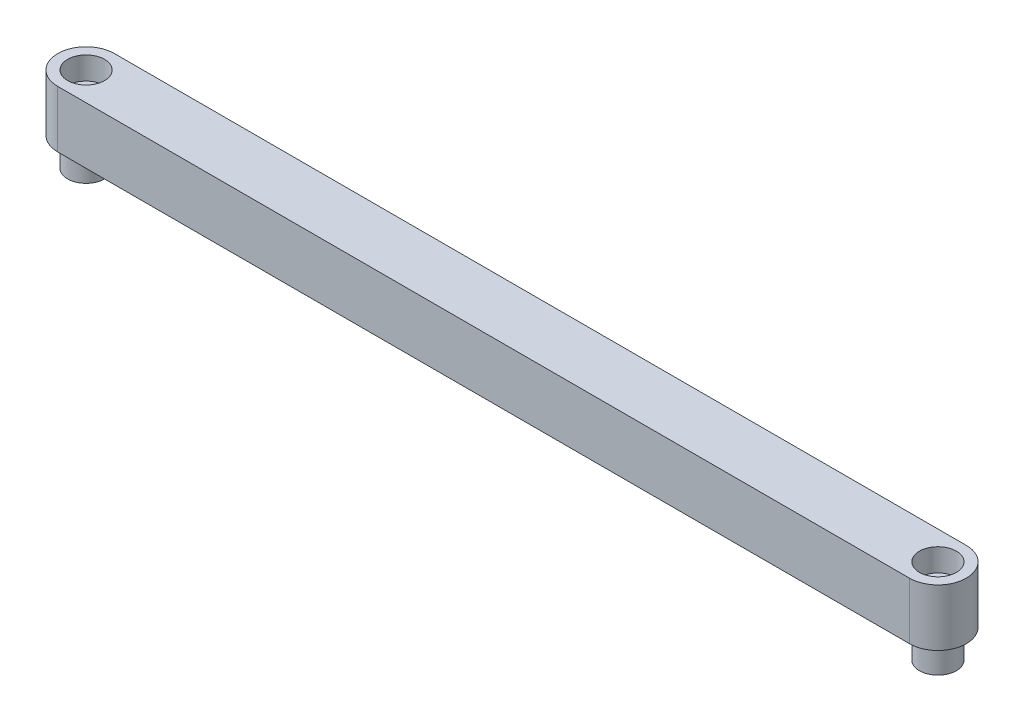
ISO-10303-21;
HEADER;
FILE_DESCRIPTION(('STEP AP214'),'2;1');
FILE_NAME('part.step','',(''),(''),'','','');
FILE_SCHEMA(('AUTOMOTIVE_DESIGN { 1 0 10303 214 1 1 1 1 }'));
ENDSEC;
DATA;
#1=APPLICATION_CONTEXT('core data for automotive mechanical design processes');
#2=APPLICATION_PROTOCOL_DEFINITION('international standard','automotive_design',2000,#1);
#3=PRODUCT_CONTEXT('',#1,'mechanical');
#4=PRODUCT('Part','Part','',(#3));
#5=PRODUCT_RELATED_PRODUCT_CATEGORY('part','',(#4));
#6=PRODUCT_DEFINITION_FORMATION('','',#4);
#7=PRODUCT_DEFINITION_CONTEXT('part definition',#1,'design');
#8=PRODUCT_DEFINITION('design','',#6,#7);
#9=PRODUCT_DEFINITION_SHAPE('','',#8);
#10=(LENGTH_UNIT() NAMED_UNIT(*) SI_UNIT(.MILLI.,.METRE.));
#11=(NAMED_UNIT(*) PLANE_ANGLE_UNIT() SI_UNIT($,.RADIAN.));
#12=(NAMED_UNIT(*) SI_UNIT($,.STERADIAN.) SOLID_ANGLE_UNIT());
#13=UNCERTAINTY_MEASURE_WITH_UNIT(LENGTH_MEASURE(1.E-05),#10,'distance_accuracy_value','');
#14=(GEOMETRIC_REPRESENTATION_CONTEXT(3) GLOBAL_UNCERTAINTY_ASSIGNED_CONTEXT((#13)) GLOBAL_UNIT_ASSIGNED_CONTEXT((#10,
#11,#12)) REPRESENTATION_CONTEXT('',''));
#15=CARTESIAN_POINT('',(0.,0.,0.));
#16=DIRECTION('',(0.,0.,1.));
#17=DIRECTION('',(1.,0.,0.));
#18=AXIS2_PLACEMENT_3D('',#15,#16,#17);
#19=CARTESIAN_POINT('',(-225.,15.,0.));
#20=DIRECTION('',(0.,-1.,0.));
#21=DIRECTION('',(0.,0.,-1.));
#22=AXIS2_PLACEMENT_3D('',#19,#20,#21);
#23=CYLINDRICAL_SURFACE('',#22,15.);
#24=CARTESIAN_POINT('',(-225.,-15.,0.));
#25=DIRECTION('',(0.,1.,0.));
#26=DIRECTION('',(0.,0.,1.));
#27=AXIS2_PLACEMENT_3D('',#24,#25,#26);
#28=CIRCLE('',#27,15.);
#29=CARTESIAN_POINT('',(-225.,-15.,-15.));
#30=VERTEX_POINT('',#29);
#31=CARTESIAN_POINT('',(-225.,-15.,15.));
#32=VERTEX_POINT('',#31);
#33=EDGE_CURVE('E104',#30,#32,#28,.T.);
#34=ORIENTED_EDGE('',*,*,#33,.T.);
#35=DIRECTION('',(0.,-1.,0.));
#36=VECTOR('',#35,1.);
#37=CARTESIAN_POINT('',(-225.,15.,15.));
#38=LINE('',#37,#36);
#39=CARTESIAN_POINT('',(-225.,15.,15.));
#40=VERTEX_POINT('',#39);
#41=EDGE_CURVE('E95',#40,#32,#38,.T.);
#42=ORIENTED_EDGE('',*,*,#41,.F.);
#43=CARTESIAN_POINT('',(-225.,15.,0.));
#44=DIRECTION('',(0.,1.,0.));
#45=DIRECTION('',(0.,0.,1.));
#46=AXIS2_PLACEMENT_3D('',#43,#44,#45);
#47=CIRCLE('',#46,15.);
#48=CARTESIAN_POINT('',(-225.,15.,-15.));
#49=VERTEX_POINT('',#48);
#50=EDGE_CURVE('E89',#49,#40,#47,.T.);
#51=ORIENTED_EDGE('',*,*,#50,.F.);
#52=DIRECTION('',(0.,-1.,0.));
#53=VECTOR('',#52,1.);
#54=CARTESIAN_POINT('',(-225.,15.,-15.));
#55=LINE('',#54,#53);
#56=EDGE_CURVE('E100',#49,#30,#55,.T.);
#57=ORIENTED_EDGE('',*,*,#56,.T.);
#58=EDGE_LOOP('',(#34,#42,#51,#57));
#59=FACE_BOUND('',#58,.T.);
#60=ADVANCED_FACE('F37',(#59),#23,.T.);
#61=CARTESIAN_POINT('',(-225.,15.,15.));
#62=DIRECTION('',(0.,0.,-1.));
#63=DIRECTION('',(-1.,0.,0.));
#64=AXIS2_PLACEMENT_3D('',#61,#62,#63);
#65=PLANE('',#64);
#66=DIRECTION('',(1.,0.,0.));
#67=VECTOR('',#66,1.);
#68=CARTESIAN_POINT('',(-225.,-15.,15.));
#69=LINE('',#68,#67);
#70=CARTESIAN_POINT('',(225.,-15.,15.));
#71=VERTEX_POINT('',#70);
#72=EDGE_CURVE('E94',#32,#71,#69,.T.);
#73=ORIENTED_EDGE('',*,*,#72,.T.);
#74=DIRECTION('',(0.,-1.,0.));
#75=VECTOR('',#74,1.);
#76=CARTESIAN_POINT('',(225.,15.,15.));
#77=LINE('',#76,#75);
#78=CARTESIAN_POINT('',(225.,15.,15.));
#79=VERTEX_POINT('',#78);
#80=EDGE_CURVE('E92',#79,#71,#77,.T.);
#81=ORIENTED_EDGE('',*,*,#80,.F.);
#82=DIRECTION('',(1.,0.,0.));
#83=VECTOR('',#82,1.);
#84=CARTESIAN_POINT('',(-225.,15.,15.));
#85=LINE('',#84,#83);
#86=EDGE_CURVE('E84',#40,#79,#85,.T.);
#87=ORIENTED_EDGE('',*,*,#86,.F.);
#88=ORIENTED_EDGE('',*,*,#41,.T.);
#89=EDGE_LOOP('',(#73,#81,#87,#88));
#90=FACE_BOUND('',#89,.T.);
#91=ADVANCED_FACE('F93',(#90),#65,.F.);
#92=CARTESIAN_POINT('',(225.,15.,0.));
#93=DIRECTION('',(0.,-1.,0.));
#94=DIRECTION('',(0.,0.,-1.));
#95=AXIS2_PLACEMENT_3D('',#92,#93,#94);
#96=CYLINDRICAL_SURFACE('',#95,15.);
#97=CARTESIAN_POINT('',(225.,-15.,0.));
#98=DIRECTION('',(0.,1.,0.));
#99=DIRECTION('',(0.,0.,1.));
#100=AXIS2_PLACEMENT_3D('',#97,#98,#99);
#101=CIRCLE('',#100,15.);
#102=CARTESIAN_POINT('',(225.,-15.,-15.));
#103=VERTEX_POINT('',#102);
#104=EDGE_CURVE('E70',#71,#103,#101,.T.);
#105=ORIENTED_EDGE('',*,*,#104,.T.);
#106=DIRECTION('',(0.,-1.,0.));
#107=VECTOR('',#106,1.);
#108=CARTESIAN_POINT('',(225.,15.,-15.));
#109=LINE('',#108,#107);
#110=CARTESIAN_POINT('',(225.,15.,-15.));
#111=VERTEX_POINT('',#110);
#112=EDGE_CURVE('E96',#111,#103,#109,.T.);
#113=ORIENTED_EDGE('',*,*,#112,.F.);
#114=CARTESIAN_POINT('',(225.,15.,0.));
#115=DIRECTION('',(0.,1.,0.));
#116=DIRECTION('',(0.,0.,1.));
#117=AXIS2_PLACEMENT_3D('',#114,#115,#116);
#118=CIRCLE('',#117,15.);
#119=EDGE_CURVE('E87',#79,#111,#118,.T.);
#120=ORIENTED_EDGE('',*,*,#119,.F.);
#121=ORIENTED_EDGE('',*,*,#80,.T.);
#122=EDGE_LOOP('',(#105,#113,#120,#121));
#123=FACE_BOUND('',#122,.T.);
#124=ADVANCED_FACE('F98',(#123),#96,.T.);
#125=CARTESIAN_POINT('',(-225.,15.,-15.));
#126=DIRECTION('',(0.,0.,1.));
#127=DIRECTION('',(1.,0.,0.));
#128=AXIS2_PLACEMENT_3D('',#125,#126,#127);
#129=PLANE('',#128);
#130=DIRECTION('',(-1.,0.,0.));
#131=VECTOR('',#130,1.);
#132=CARTESIAN_POINT('',(-225.,-15.,-15.));
#133=LINE('',#132,#131);
#134=EDGE_CURVE('E76',#103,#30,#133,.T.);
#135=ORIENTED_EDGE('',*,*,#134,.T.);
#136=ORIENTED_EDGE('',*,*,#56,.F.);
#137=DIRECTION('',(-1.,0.,0.));
#138=VECTOR('',#137,1.);
#139=CARTESIAN_POINT('',(-225.,15.,-15.));
#140=LINE('',#139,#138);
#141=EDGE_CURVE('E53',#111,#49,#140,.T.);
#142=ORIENTED_EDGE('',*,*,#141,.F.);
#143=ORIENTED_EDGE('',*,*,#112,.T.);
#144=EDGE_LOOP('',(#135,#136,#142,#143));
#145=FACE_BOUND('',#144,.T.);
#146=ADVANCED_FACE('F176',(#145),#129,.F.);
#147=CARTESIAN_POINT('',(-225.,15.,0.));
#148=DIRECTION('',(0.,1.,0.));
#149=DIRECTION('',(0.,0.,1.));
#150=AXIS2_PLACEMENT_3D('',#147,#148,#149);
#151=PLANE('',#150);
#152=CARTESIAN_POINT('',(-225.,15.,0.));
#153=DIRECTION('',(0.,1.,0.));
#154=DIRECTION('',(0.,0.,1.));
#155=AXIS2_PLACEMENT_3D('',#152,#153,#154);
#156=CIRCLE('',#155,9.75000000000002);
#157=CARTESIAN_POINT('',(-225.,15.,9.75000000000001));
#158=VERTEX_POINT('',#157);
#159=EDGE_CURVE('E107',#158,#158,#156,.T.);
#160=ORIENTED_EDGE('',*,*,#159,.F.);
#161=EDGE_LOOP('',(#160));
#162=FACE_BOUND('',#161,.T.);
#163=CARTESIAN_POINT('',(225.,15.,0.));
#164=DIRECTION('',(0.,1.,0.));
#165=DIRECTION('',(0.,0.,1.));
#166=AXIS2_PLACEMENT_3D('',#163,#164,#165);
#167=CIRCLE('',#166,9.75000000000002);
#168=CARTESIAN_POINT('',(225.,15.,9.75000000000001));
#169=VERTEX_POINT('',#168);
#170=EDGE_CURVE('E117',#169,#169,#167,.T.);
#171=ORIENTED_EDGE('',*,*,#170,.F.);
#172=EDGE_LOOP('',(#171));
#173=FACE_BOUND('',#172,.T.);
#174=ORIENTED_EDGE('',*,*,#50,.T.);
#175=ORIENTED_EDGE('',*,*,#86,.T.);
#176=ORIENTED_EDGE('',*,*,#119,.T.);
#177=ORIENTED_EDGE('',*,*,#141,.T.);
#178=EDGE_LOOP('',(#174,#175,#176,#177));
#179=FACE_BOUND('',#178,.T.);
#180=ADVANCED_FACE('F85',(#162,#173,#179),#151,.T.);
#181=CARTESIAN_POINT('',(-225.,-15.,0.));
#182=DIRECTION('',(0.,1.,0.));
#183=DIRECTION('',(0.,0.,1.));
#184=AXIS2_PLACEMENT_3D('',#181,#182,#183);
#185=PLANE('',#184);
#186=CARTESIAN_POINT('',(225.,-15.,0.));
#187=DIRECTION('',(0.,1.,0.));
#188=DIRECTION('',(0.,0.,1.));
#189=AXIS2_PLACEMENT_3D('',#186,#187,#188);
#190=CIRCLE('',#189,9.75000000000002);
#191=CARTESIAN_POINT('',(225.,-15.,9.75000000000001));
#192=VERTEX_POINT('',#191);
#193=EDGE_CURVE('E119',#192,#192,#190,.T.);
#194=ORIENTED_EDGE('',*,*,#193,.T.);
#195=EDGE_LOOP('',(#194));
#196=FACE_BOUND('',#195,.T.);
#197=CARTESIAN_POINT('',(-225.,-15.,0.));
#198=DIRECTION('',(0.,1.,0.));
#199=DIRECTION('',(0.,0.,1.));
#200=AXIS2_PLACEMENT_3D('',#197,#198,#199);
#201=CIRCLE('',#200,9.75000000000002);
#202=CARTESIAN_POINT('',(-225.,-15.,9.75000000000001));
#203=VERTEX_POINT('',#202);
#204=EDGE_CURVE('E114',#203,#203,#201,.T.);
#205=ORIENTED_EDGE('',*,*,#204,.T.);
#206=EDGE_LOOP('',(#205));
#207=FACE_BOUND('',#206,.T.);
#208=ORIENTED_EDGE('',*,*,#33,.F.);
#209=ORIENTED_EDGE('',*,*,#134,.F.);
#210=ORIENTED_EDGE('',*,*,#104,.F.);
#211=ORIENTED_EDGE('',*,*,#72,.F.);
#212=EDGE_LOOP('',(#208,#209,#210,#211));
#213=FACE_BOUND('',#212,.T.);
#214=ADVANCED_FACE('F166',(#196,#207,#213),#185,.F.);
#215=CARTESIAN_POINT('',(225.,15.,0.));
#216=DIRECTION('',(0.,-1.,0.));
#217=DIRECTION('',(0.,0.,-1.));
#218=AXIS2_PLACEMENT_3D('',#215,#216,#217);
#219=CYLINDRICAL_SURFACE('',#218,9.75000000000002);
#220=CARTESIAN_POINT('',(225.,3.,0.));
#221=DIRECTION('',(0.,1.,0.));
#222=DIRECTION('',(0.,0.,1.));
#223=AXIS2_PLACEMENT_3D('',#220,#221,#222);
#224=CIRCLE('',#223,9.75000000000002);
#225=CARTESIAN_POINT('',(225.,3.,9.75000000000001));
#226=VERTEX_POINT('',#225);
#227=EDGE_CURVE('E11',#226,#226,#224,.T.);
#228=ORIENTED_EDGE('',*,*,#227,.F.);
#229=EDGE_LOOP('',(#228));
#230=FACE_BOUND('',#229,.T.);
#231=ORIENTED_EDGE('',*,*,#170,.T.);
#232=EDGE_LOOP('',(#231));
#233=FACE_BOUND('',#232,.T.);
#234=ADVANCED_FACE('F131',(#230,#233),#219,.F.);
#235=CARTESIAN_POINT('',(-225.,15.,0.));
#236=DIRECTION('',(0.,-1.,0.));
#237=DIRECTION('',(0.,0.,-1.));
#238=AXIS2_PLACEMENT_3D('',#235,#236,#237);
#239=CYLINDRICAL_SURFACE('',#238,9.75000000000002);
#240=CARTESIAN_POINT('',(-225.,3.,0.));
#241=DIRECTION('',(0.,1.,0.));
#242=DIRECTION('',(0.,0.,1.));
#243=AXIS2_PLACEMENT_3D('',#240,#241,#242);
#244=CIRCLE('',#243,9.75000000000002);
#245=CARTESIAN_POINT('',(-225.,3.,9.75000000000001));
#246=VERTEX_POINT('',#245);
#247=EDGE_CURVE('E45',#246,#246,#244,.T.);
#248=ORIENTED_EDGE('',*,*,#247,.F.);
#249=EDGE_LOOP('',(#248));
#250=FACE_BOUND('',#249,.T.);
#251=ORIENTED_EDGE('',*,*,#159,.T.);
#252=EDGE_LOOP('',(#251));
#253=FACE_BOUND('',#252,.T.);
#254=ADVANCED_FACE('F127',(#250,#253),#239,.F.);
#255=CARTESIAN_POINT('',(-225.,-30.,0.));
#256=DIRECTION('',(0.,1.,0.));
#257=DIRECTION('',(0.,0.,1.));
#258=AXIS2_PLACEMENT_3D('',#255,#256,#257);
#259=CYLINDRICAL_SURFACE('',#258,9.75000000000002);
#260=CARTESIAN_POINT('',(-225.,-30.,0.));
#261=DIRECTION('',(0.,1.,0.));
#262=DIRECTION('',(0.,0.,1.));
#263=AXIS2_PLACEMENT_3D('',#260,#261,#262);
#264=CIRCLE('',#263,9.75000000000002);
#265=CARTESIAN_POINT('',(-225.,-30.,9.75000000000001));
#266=VERTEX_POINT('',#265);
#267=EDGE_CURVE('E118',#266,#266,#264,.T.);
#268=ORIENTED_EDGE('',*,*,#267,.T.);
#269=EDGE_LOOP('',(#268));
#270=FACE_BOUND('',#269,.T.);
#271=ORIENTED_EDGE('',*,*,#204,.F.);
#272=EDGE_LOOP('',(#271));
#273=FACE_BOUND('',#272,.T.);
#274=ADVANCED_FACE('F130',(#270,#273),#259,.T.);
#275=CARTESIAN_POINT('',(-225.,-30.,0.));
#276=DIRECTION('',(0.,1.,0.));
#277=DIRECTION('',(0.,0.,1.));
#278=AXIS2_PLACEMENT_3D('',#275,#276,#277);
#279=PLANE('',#278);
#280=ORIENTED_EDGE('',*,*,#267,.F.);
#281=EDGE_LOOP('',(#280));
#282=FACE_BOUND('',#281,.T.);
#283=ADVANCED_FACE('F157',(#282),#279,.F.);
#284=CARTESIAN_POINT('',(225.,-30.,0.));
#285=DIRECTION('',(0.,1.,0.));
#286=DIRECTION('',(0.,0.,1.));
#287=AXIS2_PLACEMENT_3D('',#284,#285,#286);
#288=CYLINDRICAL_SURFACE('',#287,9.75000000000002);
#289=CARTESIAN_POINT('',(225.,-30.,0.));
#290=DIRECTION('',(0.,1.,0.));
#291=DIRECTION('',(0.,0.,1.));
#292=AXIS2_PLACEMENT_3D('',#289,#290,#291);
#293=CIRCLE('',#292,9.75000000000002);
#294=CARTESIAN_POINT('',(225.,-30.,9.75000000000001));
#295=VERTEX_POINT('',#294);
#296=EDGE_CURVE('E121',#295,#295,#293,.T.);
#297=ORIENTED_EDGE('',*,*,#296,.T.);
#298=EDGE_LOOP('',(#297));
#299=FACE_BOUND('',#298,.T.);
#300=ORIENTED_EDGE('',*,*,#193,.F.);
#301=EDGE_LOOP('',(#300));
#302=FACE_BOUND('',#301,.T.);
#303=ADVANCED_FACE('F145',(#299,#302),#288,.T.);
#304=CARTESIAN_POINT('',(225.,-30.,0.));
#305=DIRECTION('',(0.,1.,0.));
#306=DIRECTION('',(0.,0.,1.));
#307=AXIS2_PLACEMENT_3D('',#304,#305,#306);
#308=PLANE('',#307);
#309=ORIENTED_EDGE('',*,*,#296,.F.);
#310=EDGE_LOOP('',(#309));
#311=FACE_BOUND('',#310,.T.);
#312=ADVANCED_FACE('F148',(#311),#308,.F.);
#313=CARTESIAN_POINT('',(-225.,3.,0.));
#314=DIRECTION('',(0.,1.,0.));
#315=DIRECTION('',(0.,0.,1.));
#316=AXIS2_PLACEMENT_3D('',#313,#314,#315);
#317=PLANE('',#316);
#318=ORIENTED_EDGE('',*,*,#247,.T.);
#319=EDGE_LOOP('',(#318));
#320=FACE_BOUND('',#319,.T.);
#321=ADVANCED_FACE('F125',(#320),#317,.T.);
#322=CARTESIAN_POINT('',(225.,3.,0.));
#323=DIRECTION('',(0.,1.,0.));
#324=DIRECTION('',(0.,0.,1.));
#325=AXIS2_PLACEMENT_3D('',#322,#323,#324);
#326=PLANE('',#325);
#327=ORIENTED_EDGE('',*,*,#227,.T.);
#328=EDGE_LOOP('',(#327));
#329=FACE_BOUND('',#328,.T.);
#330=ADVANCED_FACE('F155',(#329),#326,.T.);
#331=CLOSED_SHELL('',(#60,#91,#124,#146,#180,#214,#234,#254,#274,#283,#303,#312,#321,#330));
#332=MANIFOLD_SOLID_BREP('B2',#331);
#333=ADVANCED_BREP_SHAPE_REPRESENTATION('',(#18,#332),#14);
#334=SHAPE_DEFINITION_REPRESENTATION(#9,#333);
ENDSEC;
END-ISO-10303-21;
